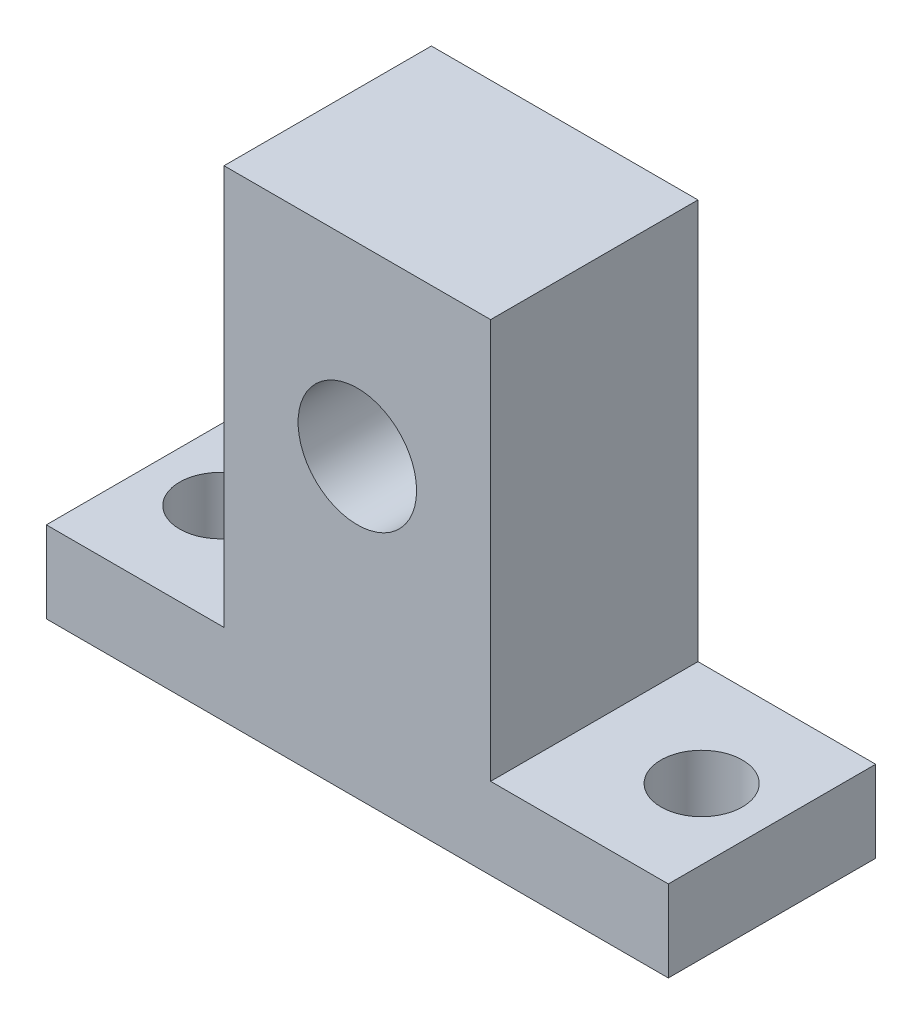
ISO-10303-21;
HEADER;
FILE_DESCRIPTION(('STEP AP214'),'2;1');
FILE_NAME('part.step','',(''),(''),'','','');
FILE_SCHEMA(('AUTOMOTIVE_DESIGN { 1 0 10303 214 1 1 1 1 }'));
ENDSEC;
DATA;
#1=APPLICATION_CONTEXT('core data for automotive mechanical design processes');
#2=APPLICATION_PROTOCOL_DEFINITION('international standard','automotive_design',2000,#1);
#3=PRODUCT_CONTEXT('',#1,'mechanical');
#4=PRODUCT('Part','Part','',(#3));
#5=PRODUCT_RELATED_PRODUCT_CATEGORY('part','',(#4));
#6=PRODUCT_DEFINITION_FORMATION('','',#4);
#7=PRODUCT_DEFINITION_CONTEXT('part definition',#1,'design');
#8=PRODUCT_DEFINITION('design','',#6,#7);
#9=PRODUCT_DEFINITION_SHAPE('','',#8);
#10=(LENGTH_UNIT() NAMED_UNIT(*) SI_UNIT(.MILLI.,.METRE.));
#11=(NAMED_UNIT(*) PLANE_ANGLE_UNIT() SI_UNIT($,.RADIAN.));
#12=(NAMED_UNIT(*) SI_UNIT($,.STERADIAN.) SOLID_ANGLE_UNIT());
#13=UNCERTAINTY_MEASURE_WITH_UNIT(LENGTH_MEASURE(1.E-05),#10,'distance_accuracy_value','');
#14=(GEOMETRIC_REPRESENTATION_CONTEXT(3) GLOBAL_UNCERTAINTY_ASSIGNED_CONTEXT((#13)) GLOBAL_UNIT_ASSIGNED_CONTEXT((#10,
#11,#12)) REPRESENTATION_CONTEXT('',''));
#15=CARTESIAN_POINT('',(0.,0.,0.));
#16=DIRECTION('',(0.,0.,1.));
#17=DIRECTION('',(1.,0.,0.));
#18=AXIS2_PLACEMENT_3D('',#15,#16,#17);
#19=CARTESIAN_POINT('',(0.,0.,14.));
#20=DIRECTION('',(0.,0.,-1.));
#21=DIRECTION('',(-1.,0.,0.));
#22=AXIS2_PLACEMENT_3D('',#19,#20,#21);
#23=PLANE('',#22);
#24=DIRECTION('',(0.,-1.,0.));
#25=VECTOR('',#24,1.);
#26=CARTESIAN_POINT('',(-21.,-16.25,14.));
#27=LINE('',#26,#25);
#28=CARTESIAN_POINT('',(-21.,-10.75,14.));
#29=VERTEX_POINT('',#28);
#30=CARTESIAN_POINT('',(-21.,-16.25,14.));
#31=VERTEX_POINT('',#30);
#32=EDGE_CURVE('E146',#29,#31,#27,.T.);
#33=ORIENTED_EDGE('',*,*,#32,.T.);
#34=DIRECTION('',(1.,0.,0.));
#35=VECTOR('',#34,1.);
#36=CARTESIAN_POINT('',(-21.,-16.25,14.));
#37=LINE('',#36,#35);
#38=CARTESIAN_POINT('',(21.,-16.25,14.));
#39=VERTEX_POINT('',#38);
#40=EDGE_CURVE('E94',#31,#39,#37,.T.);
#41=ORIENTED_EDGE('',*,*,#40,.T.);
#42=DIRECTION('',(0.,1.,0.));
#43=VECTOR('',#42,1.);
#44=CARTESIAN_POINT('',(21.,-16.25,14.));
#45=LINE('',#44,#43);
#46=CARTESIAN_POINT('',(21.,-10.75,14.));
#47=VERTEX_POINT('',#46);
#48=EDGE_CURVE('E161',#39,#47,#45,.T.);
#49=ORIENTED_EDGE('',*,*,#48,.T.);
#50=DIRECTION('',(-1.,0.,0.));
#51=VECTOR('',#50,1.);
#52=CARTESIAN_POINT('',(21.,-10.75,14.));
#53=LINE('',#52,#51);
#54=CARTESIAN_POINT('',(8.99999999999999,-10.75,14.));
#55=VERTEX_POINT('',#54);
#56=EDGE_CURVE('E174',#47,#55,#53,.T.);
#57=ORIENTED_EDGE('',*,*,#56,.T.);
#58=DIRECTION('',(0.,1.,0.));
#59=VECTOR('',#58,1.);
#60=CARTESIAN_POINT('',(8.99999999999999,-10.75,14.));
#61=LINE('',#60,#59);
#62=CARTESIAN_POINT('',(8.99999999999999,16.25,14.));
#63=VERTEX_POINT('',#62);
#64=EDGE_CURVE('E113',#55,#63,#61,.T.);
#65=ORIENTED_EDGE('',*,*,#64,.T.);
#66=DIRECTION('',(-1.,0.,0.));
#67=VECTOR('',#66,1.);
#68=CARTESIAN_POINT('',(-9.,16.25,14.));
#69=LINE('',#68,#67);
#70=CARTESIAN_POINT('',(-9.,16.25,14.));
#71=VERTEX_POINT('',#70);
#72=EDGE_CURVE('E107',#63,#71,#69,.T.);
#73=ORIENTED_EDGE('',*,*,#72,.T.);
#74=DIRECTION('',(0.,-1.,0.));
#75=VECTOR('',#74,1.);
#76=CARTESIAN_POINT('',(-9.,-10.75,14.));
#77=LINE('',#76,#75);
#78=CARTESIAN_POINT('',(-9.,-10.75,14.));
#79=VERTEX_POINT('',#78);
#80=EDGE_CURVE('E111',#71,#79,#77,.T.);
#81=ORIENTED_EDGE('',*,*,#80,.T.);
#82=DIRECTION('',(-1.,0.,0.));
#83=VECTOR('',#82,1.);
#84=CARTESIAN_POINT('',(-21.,-10.75,14.));
#85=LINE('',#84,#83);
#86=EDGE_CURVE('E51',#79,#29,#85,.T.);
#87=ORIENTED_EDGE('',*,*,#86,.T.);
#88=EDGE_LOOP('',(#33,#41,#49,#57,#65,#73,#81,#87));
#89=FACE_BOUND('',#88,.T.);
#90=CARTESIAN_POINT('',(0.,3.74999999999999,14.));
#91=DIRECTION('',(0.,0.,1.));
#92=DIRECTION('',(1.,0.,0.));
#93=AXIS2_PLACEMENT_3D('',#90,#91,#92);
#94=CIRCLE('',#93,4.);
#95=CARTESIAN_POINT('',(3.99999999999999,3.74999999999999,14.));
#96=VERTEX_POINT('',#95);
#97=EDGE_CURVE('E135',#96,#96,#94,.T.);
#98=ORIENTED_EDGE('',*,*,#97,.F.);
#99=EDGE_LOOP('',(#98));
#100=FACE_BOUND('',#99,.T.);
#101=ADVANCED_FACE('F34',(#89,#100),#23,.F.);
#102=CARTESIAN_POINT('',(0.,0.,0.));
#103=DIRECTION('',(0.,0.,-1.));
#104=DIRECTION('',(-1.,0.,0.));
#105=AXIS2_PLACEMENT_3D('',#102,#103,#104);
#106=PLANE('',#105);
#107=DIRECTION('',(0.,-1.,0.));
#108=VECTOR('',#107,1.);
#109=CARTESIAN_POINT('',(-21.,-16.25,0.));
#110=LINE('',#109,#108);
#111=CARTESIAN_POINT('',(-21.,-10.75,0.));
#112=VERTEX_POINT('',#111);
#113=CARTESIAN_POINT('',(-21.,-16.25,0.));
#114=VERTEX_POINT('',#113);
#115=EDGE_CURVE('E131',#112,#114,#110,.T.);
#116=ORIENTED_EDGE('',*,*,#115,.F.);
#117=DIRECTION('',(-1.,0.,0.));
#118=VECTOR('',#117,1.);
#119=CARTESIAN_POINT('',(-21.,-10.75,0.));
#120=LINE('',#119,#118);
#121=CARTESIAN_POINT('',(-9.,-10.75,0.));
#122=VERTEX_POINT('',#121);
#123=EDGE_CURVE('E86',#122,#112,#120,.T.);
#124=ORIENTED_EDGE('',*,*,#123,.F.);
#125=DIRECTION('',(0.,-1.,0.));
#126=VECTOR('',#125,1.);
#127=CARTESIAN_POINT('',(-9.,-10.75,0.));
#128=LINE('',#127,#126);
#129=CARTESIAN_POINT('',(-9.,16.25,0.));
#130=VERTEX_POINT('',#129);
#131=EDGE_CURVE('E80',#130,#122,#128,.T.);
#132=ORIENTED_EDGE('',*,*,#131,.F.);
#133=DIRECTION('',(-1.,0.,0.));
#134=VECTOR('',#133,1.);
#135=CARTESIAN_POINT('',(-9.,16.25,0.));
#136=LINE('',#135,#134);
#137=CARTESIAN_POINT('',(8.99999999999999,16.25,0.));
#138=VERTEX_POINT('',#137);
#139=EDGE_CURVE('E121',#138,#130,#136,.T.);
#140=ORIENTED_EDGE('',*,*,#139,.F.);
#141=DIRECTION('',(0.,1.,0.));
#142=VECTOR('',#141,1.);
#143=CARTESIAN_POINT('',(8.99999999999999,-10.75,0.));
#144=LINE('',#143,#142);
#145=CARTESIAN_POINT('',(8.99999999999999,-10.75,0.));
#146=VERTEX_POINT('',#145);
#147=EDGE_CURVE('E141',#146,#138,#144,.T.);
#148=ORIENTED_EDGE('',*,*,#147,.F.);
#149=DIRECTION('',(-1.,0.,0.));
#150=VECTOR('',#149,1.);
#151=CARTESIAN_POINT('',(21.,-10.75,0.));
#152=LINE('',#151,#150);
#153=CARTESIAN_POINT('',(21.,-10.75,0.));
#154=VERTEX_POINT('',#153);
#155=EDGE_CURVE('E139',#154,#146,#152,.T.);
#156=ORIENTED_EDGE('',*,*,#155,.F.);
#157=DIRECTION('',(0.,1.,0.));
#158=VECTOR('',#157,1.);
#159=CARTESIAN_POINT('',(21.,-16.25,0.));
#160=LINE('',#159,#158);
#161=CARTESIAN_POINT('',(21.,-16.25,0.));
#162=VERTEX_POINT('',#161);
#163=EDGE_CURVE('E137',#162,#154,#160,.T.);
#164=ORIENTED_EDGE('',*,*,#163,.F.);
#165=DIRECTION('',(1.,0.,0.));
#166=VECTOR('',#165,1.);
#167=CARTESIAN_POINT('',(-21.,-16.25,0.));
#168=LINE('',#167,#166);
#169=EDGE_CURVE('E134',#114,#162,#168,.T.);
#170=ORIENTED_EDGE('',*,*,#169,.F.);
#171=EDGE_LOOP('',(#116,#124,#132,#140,#148,#156,#164,#170));
#172=FACE_BOUND('',#171,.T.);
#173=CARTESIAN_POINT('',(0.,3.74999999999999,0.));
#174=DIRECTION('',(0.,0.,1.));
#175=DIRECTION('',(1.,0.,0.));
#176=AXIS2_PLACEMENT_3D('',#173,#174,#175);
#177=CIRCLE('',#176,4.);
#178=CARTESIAN_POINT('',(3.99999999999999,3.74999999999999,0.));
#179=VERTEX_POINT('',#178);
#180=EDGE_CURVE('E180',#179,#179,#177,.T.);
#181=ORIENTED_EDGE('',*,*,#180,.T.);
#182=EDGE_LOOP('',(#181));
#183=FACE_BOUND('',#182,.T.);
#184=ADVANCED_FACE('F165',(#172,#183),#106,.T.);
#185=CARTESIAN_POINT('',(-21.,-16.25,14.));
#186=DIRECTION('',(1.,0.,0.));
#187=DIRECTION('',(0.,0.,-1.));
#188=AXIS2_PLACEMENT_3D('',#185,#186,#187);
#189=PLANE('',#188);
#190=ORIENTED_EDGE('',*,*,#115,.T.);
#191=DIRECTION('',(0.,0.,-1.));
#192=VECTOR('',#191,1.);
#193=CARTESIAN_POINT('',(-21.,-16.25,14.));
#194=LINE('',#193,#192);
#195=EDGE_CURVE('E11',#31,#114,#194,.T.);
#196=ORIENTED_EDGE('',*,*,#195,.F.);
#197=ORIENTED_EDGE('',*,*,#32,.F.);
#198=DIRECTION('',(0.,0.,-1.));
#199=VECTOR('',#198,1.);
#200=CARTESIAN_POINT('',(-21.,-10.75,14.));
#201=LINE('',#200,#199);
#202=EDGE_CURVE('E127',#29,#112,#201,.T.);
#203=ORIENTED_EDGE('',*,*,#202,.T.);
#204=EDGE_LOOP('',(#190,#196,#197,#203));
#205=FACE_BOUND('',#204,.T.);
#206=ADVANCED_FACE('F36',(#205),#189,.F.);
#207=CARTESIAN_POINT('',(-21.,-16.25,14.));
#208=DIRECTION('',(0.,1.,0.));
#209=DIRECTION('',(0.,0.,1.));
#210=AXIS2_PLACEMENT_3D('',#207,#208,#209);
#211=PLANE('',#210);
#212=CARTESIAN_POINT('',(16.25,-16.25,7.00000000000001));
#213=DIRECTION('',(0.,1.,0.));
#214=DIRECTION('',(0.,0.,1.));
#215=AXIS2_PLACEMENT_3D('',#212,#213,#214);
#216=CIRCLE('',#215,2.75);
#217=CARTESIAN_POINT('',(16.25,-16.25,9.75));
#218=VERTEX_POINT('',#217);
#219=EDGE_CURVE('E191',#218,#218,#216,.T.);
#220=ORIENTED_EDGE('',*,*,#219,.T.);
#221=EDGE_LOOP('',(#220));
#222=FACE_BOUND('',#221,.T.);
#223=CARTESIAN_POINT('',(-16.25,-16.25,7.00000000000001));
#224=DIRECTION('',(0.,1.,0.));
#225=DIRECTION('',(0.,0.,1.));
#226=AXIS2_PLACEMENT_3D('',#223,#224,#225);
#227=CIRCLE('',#226,2.75);
#228=CARTESIAN_POINT('',(-16.25,-16.25,9.75));
#229=VERTEX_POINT('',#228);
#230=EDGE_CURVE('E183',#229,#229,#227,.T.);
#231=ORIENTED_EDGE('',*,*,#230,.T.);
#232=EDGE_LOOP('',(#231));
#233=FACE_BOUND('',#232,.T.);
#234=ORIENTED_EDGE('',*,*,#169,.T.);
#235=DIRECTION('',(0.,0.,-1.));
#236=VECTOR('',#235,1.);
#237=CARTESIAN_POINT('',(21.,-16.25,14.));
#238=LINE('',#237,#236);
#239=EDGE_CURVE('E43',#39,#162,#238,.T.);
#240=ORIENTED_EDGE('',*,*,#239,.F.);
#241=ORIENTED_EDGE('',*,*,#40,.F.);
#242=ORIENTED_EDGE('',*,*,#195,.T.);
#243=EDGE_LOOP('',(#234,#240,#241,#242));
#244=FACE_BOUND('',#243,.T.);
#245=ADVANCED_FACE('F208',(#222,#233,#244),#211,.F.);
#246=CARTESIAN_POINT('',(21.,-16.25,14.));
#247=DIRECTION('',(-1.,0.,0.));
#248=DIRECTION('',(0.,-1.,0.));
#249=AXIS2_PLACEMENT_3D('',#246,#247,#248);
#250=PLANE('',#249);
#251=ORIENTED_EDGE('',*,*,#163,.T.);
#252=DIRECTION('',(0.,0.,-1.));
#253=VECTOR('',#252,1.);
#254=CARTESIAN_POINT('',(21.,-10.75,14.));
#255=LINE('',#254,#253);
#256=EDGE_CURVE('E153',#47,#154,#255,.T.);
#257=ORIENTED_EDGE('',*,*,#256,.F.);
#258=ORIENTED_EDGE('',*,*,#48,.F.);
#259=ORIENTED_EDGE('',*,*,#239,.T.);
#260=EDGE_LOOP('',(#251,#257,#258,#259));
#261=FACE_BOUND('',#260,.T.);
#262=ADVANCED_FACE('F159',(#261),#250,.F.);
#263=CARTESIAN_POINT('',(21.,-10.75,14.));
#264=DIRECTION('',(0.,-1.,0.));
#265=DIRECTION('',(0.,0.,-1.));
#266=AXIS2_PLACEMENT_3D('',#263,#264,#265);
#267=PLANE('',#266);
#268=CARTESIAN_POINT('',(16.25,-10.75,7.00000000000001));
#269=DIRECTION('',(0.,1.,0.));
#270=DIRECTION('',(0.,0.,1.));
#271=AXIS2_PLACEMENT_3D('',#268,#269,#270);
#272=CIRCLE('',#271,2.75);
#273=CARTESIAN_POINT('',(16.25,-10.75,9.75));
#274=VERTEX_POINT('',#273);
#275=EDGE_CURVE('E194',#274,#274,#272,.T.);
#276=ORIENTED_EDGE('',*,*,#275,.F.);
#277=EDGE_LOOP('',(#276));
#278=FACE_BOUND('',#277,.T.);
#279=ORIENTED_EDGE('',*,*,#155,.T.);
#280=DIRECTION('',(0.,0.,-1.));
#281=VECTOR('',#280,1.);
#282=CARTESIAN_POINT('',(8.99999999999999,-10.75,14.));
#283=LINE('',#282,#281);
#284=EDGE_CURVE('E150',#55,#146,#283,.T.);
#285=ORIENTED_EDGE('',*,*,#284,.F.);
#286=ORIENTED_EDGE('',*,*,#56,.F.);
#287=ORIENTED_EDGE('',*,*,#256,.T.);
#288=EDGE_LOOP('',(#279,#285,#286,#287));
#289=FACE_BOUND('',#288,.T.);
#290=ADVANCED_FACE('F170',(#278,#289),#267,.F.);
#291=CARTESIAN_POINT('',(8.99999999999999,-10.75,14.));
#292=DIRECTION('',(-1.,0.,0.));
#293=DIRECTION('',(0.,0.,1.));
#294=AXIS2_PLACEMENT_3D('',#291,#292,#293);
#295=PLANE('',#294);
#296=ORIENTED_EDGE('',*,*,#147,.T.);
#297=DIRECTION('',(0.,0.,-1.));
#298=VECTOR('',#297,1.);
#299=CARTESIAN_POINT('',(8.99999999999999,16.25,14.));
#300=LINE('',#299,#298);
#301=EDGE_CURVE('E122',#63,#138,#300,.T.);
#302=ORIENTED_EDGE('',*,*,#301,.F.);
#303=ORIENTED_EDGE('',*,*,#64,.F.);
#304=ORIENTED_EDGE('',*,*,#284,.T.);
#305=EDGE_LOOP('',(#296,#302,#303,#304));
#306=FACE_BOUND('',#305,.T.);
#307=ADVANCED_FACE('F173',(#306),#295,.F.);
#308=CARTESIAN_POINT('',(-9.,16.25,14.));
#309=DIRECTION('',(0.,-1.,0.));
#310=DIRECTION('',(0.,0.,-1.));
#311=AXIS2_PLACEMENT_3D('',#308,#309,#310);
#312=PLANE('',#311);
#313=ORIENTED_EDGE('',*,*,#139,.T.);
#314=DIRECTION('',(0.,0.,-1.));
#315=VECTOR('',#314,1.);
#316=CARTESIAN_POINT('',(-9.,16.25,14.));
#317=LINE('',#316,#315);
#318=EDGE_CURVE('E118',#71,#130,#317,.T.);
#319=ORIENTED_EDGE('',*,*,#318,.F.);
#320=ORIENTED_EDGE('',*,*,#72,.F.);
#321=ORIENTED_EDGE('',*,*,#301,.T.);
#322=EDGE_LOOP('',(#313,#319,#320,#321));
#323=FACE_BOUND('',#322,.T.);
#324=ADVANCED_FACE('F119',(#323),#312,.F.);
#325=CARTESIAN_POINT('',(-9.,-10.75,14.));
#326=DIRECTION('',(1.,0.,0.));
#327=DIRECTION('',(0.,0.,-1.));
#328=AXIS2_PLACEMENT_3D('',#325,#326,#327);
#329=PLANE('',#328);
#330=ORIENTED_EDGE('',*,*,#131,.T.);
#331=DIRECTION('',(0.,0.,-1.));
#332=VECTOR('',#331,1.);
#333=CARTESIAN_POINT('',(-9.,-10.75,14.));
#334=LINE('',#333,#332);
#335=EDGE_CURVE('E123',#79,#122,#334,.T.);
#336=ORIENTED_EDGE('',*,*,#335,.F.);
#337=ORIENTED_EDGE('',*,*,#80,.F.);
#338=ORIENTED_EDGE('',*,*,#318,.T.);
#339=EDGE_LOOP('',(#330,#336,#337,#338));
#340=FACE_BOUND('',#339,.T.);
#341=ADVANCED_FACE('F125',(#340),#329,.F.);
#342=CARTESIAN_POINT('',(-21.,-10.75,14.));
#343=DIRECTION('',(0.,-1.,0.));
#344=DIRECTION('',(0.,0.,-1.));
#345=AXIS2_PLACEMENT_3D('',#342,#343,#344);
#346=PLANE('',#345);
#347=CARTESIAN_POINT('',(-16.25,-10.75,7.00000000000001));
#348=DIRECTION('',(0.,1.,0.));
#349=DIRECTION('',(0.,0.,1.));
#350=AXIS2_PLACEMENT_3D('',#347,#348,#349);
#351=CIRCLE('',#350,2.75);
#352=CARTESIAN_POINT('',(-16.25,-10.75,9.75));
#353=VERTEX_POINT('',#352);
#354=EDGE_CURVE('E188',#353,#353,#351,.T.);
#355=ORIENTED_EDGE('',*,*,#354,.F.);
#356=EDGE_LOOP('',(#355));
#357=FACE_BOUND('',#356,.T.);
#358=ORIENTED_EDGE('',*,*,#123,.T.);
#359=ORIENTED_EDGE('',*,*,#202,.F.);
#360=ORIENTED_EDGE('',*,*,#86,.F.);
#361=ORIENTED_EDGE('',*,*,#335,.T.);
#362=EDGE_LOOP('',(#358,#359,#360,#361));
#363=FACE_BOUND('',#362,.T.);
#364=ADVANCED_FACE('F220',(#357,#363),#346,.F.);
#365=CARTESIAN_POINT('',(0.,3.74999999999999,14.));
#366=DIRECTION('',(0.,0.,-1.));
#367=DIRECTION('',(-1.,0.,0.));
#368=AXIS2_PLACEMENT_3D('',#365,#366,#367);
#369=CYLINDRICAL_SURFACE('',#368,4.);
#370=ORIENTED_EDGE('',*,*,#97,.T.);
#371=EDGE_LOOP('',(#370));
#372=FACE_BOUND('',#371,.T.);
#373=ORIENTED_EDGE('',*,*,#180,.F.);
#374=EDGE_LOOP('',(#373));
#375=FACE_BOUND('',#374,.T.);
#376=ADVANCED_FACE('F217',(#372,#375),#369,.F.);
#377=CARTESIAN_POINT('',(-16.25,-24.75,7.00000000000001));
#378=DIRECTION('',(0.,1.,0.));
#379=DIRECTION('',(0.,0.,1.));
#380=AXIS2_PLACEMENT_3D('',#377,#378,#379);
#381=CYLINDRICAL_SURFACE('',#380,2.75);
#382=ORIENTED_EDGE('',*,*,#354,.T.);
#383=EDGE_LOOP('',(#382));
#384=FACE_BOUND('',#383,.T.);
#385=ORIENTED_EDGE('',*,*,#230,.F.);
#386=EDGE_LOOP('',(#385));
#387=FACE_BOUND('',#386,.T.);
#388=ADVANCED_FACE('F246',(#384,#387),#381,.F.);
#389=CARTESIAN_POINT('',(16.25,-24.75,7.00000000000001));
#390=DIRECTION('',(0.,1.,0.));
#391=DIRECTION('',(0.,0.,1.));
#392=AXIS2_PLACEMENT_3D('',#389,#390,#391);
#393=CYLINDRICAL_SURFACE('',#392,2.75);
#394=ORIENTED_EDGE('',*,*,#275,.T.);
#395=EDGE_LOOP('',(#394));
#396=FACE_BOUND('',#395,.T.);
#397=ORIENTED_EDGE('',*,*,#219,.F.);
#398=EDGE_LOOP('',(#397));
#399=FACE_BOUND('',#398,.T.);
#400=ADVANCED_FACE('F198',(#396,#399),#393,.F.);
#401=CLOSED_SHELL('',(#101,#184,#206,#245,#262,#290,#307,#324,#341,#364,#376,#388,#400));
#402=MANIFOLD_SOLID_BREP('B2',#401);
#403=ADVANCED_BREP_SHAPE_REPRESENTATION('',(#18,#402),#14);
#404=SHAPE_DEFINITION_REPRESENTATION(#9,#403);
ENDSEC;
END-ISO-10303-21;
